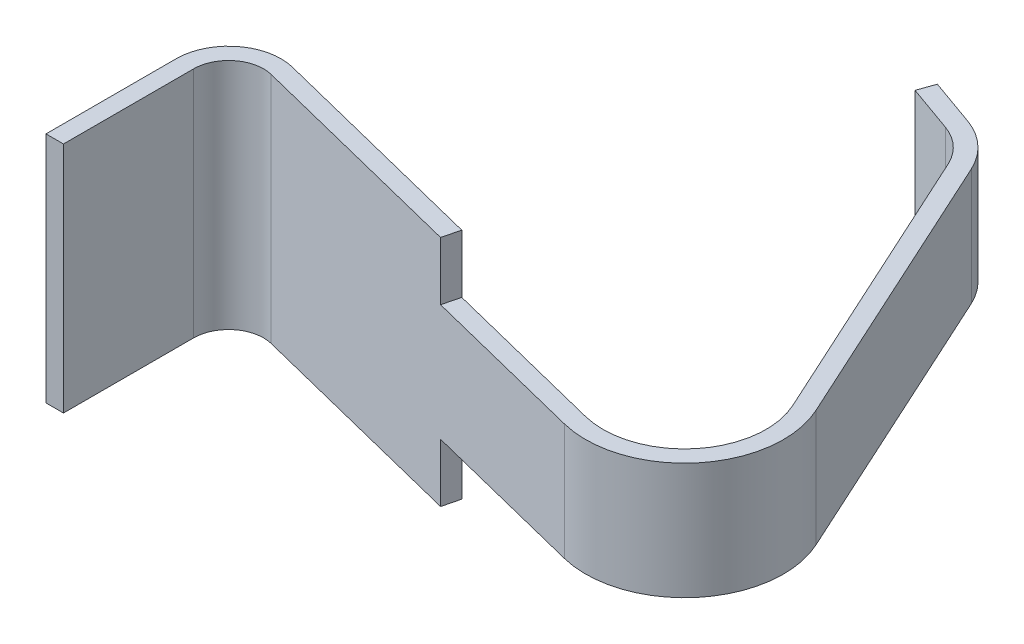
ISO-10303-21;
HEADER;
FILE_DESCRIPTION(('STEP AP214'),'2;1');
FILE_NAME('part.step','',(''),(''),'','','');
FILE_SCHEMA(('AUTOMOTIVE_DESIGN { 1 0 10303 214 1 1 1 1 }'));
ENDSEC;
DATA;
#1=APPLICATION_CONTEXT('core data for automotive mechanical design processes');
#2=APPLICATION_PROTOCOL_DEFINITION('international standard','automotive_design',2000,#1);
#3=PRODUCT_CONTEXT('',#1,'mechanical');
#4=PRODUCT('Part','Part','',(#3));
#5=PRODUCT_RELATED_PRODUCT_CATEGORY('part','',(#4));
#6=PRODUCT_DEFINITION_FORMATION('','',#4);
#7=PRODUCT_DEFINITION_CONTEXT('part definition',#1,'design');
#8=PRODUCT_DEFINITION('design','',#6,#7);
#9=PRODUCT_DEFINITION_SHAPE('','',#8);
#10=(LENGTH_UNIT() NAMED_UNIT(*) SI_UNIT(.MILLI.,.METRE.));
#11=(NAMED_UNIT(*) PLANE_ANGLE_UNIT() SI_UNIT($,.RADIAN.));
#12=(NAMED_UNIT(*) SI_UNIT($,.STERADIAN.) SOLID_ANGLE_UNIT());
#13=UNCERTAINTY_MEASURE_WITH_UNIT(LENGTH_MEASURE(1.E-05),#10,'distance_accuracy_value','');
#14=(GEOMETRIC_REPRESENTATION_CONTEXT(3) GLOBAL_UNCERTAINTY_ASSIGNED_CONTEXT((#13)) GLOBAL_UNIT_ASSIGNED_CONTEXT((#10,
#11,#12)) REPRESENTATION_CONTEXT('',''));
#15=CARTESIAN_POINT('',(0.,0.,0.));
#16=DIRECTION('',(0.,0.,1.));
#17=DIRECTION('',(1.,0.,0.));
#18=AXIS2_PLACEMENT_3D('',#15,#16,#17);
#19=CARTESIAN_POINT('',(77.525,12.04,-18.95765388203));
#20=DIRECTION('',(-1.,0.,0.));
#21=DIRECTION('',(0.,0.,-1.));
#22=AXIS2_PLACEMENT_3D('',#19,#20,#21);
#23=PLANE('',#22);
#24=DIRECTION('',(0.,0.,-1.));
#25=VECTOR('',#24,1.);
#26=CARTESIAN_POINT('',(77.525,12.,-19.5386529492));
#27=LINE('',#26,#25);
#28=CARTESIAN_POINT('',(77.5249999999993,12.,-18.9799999999987));
#29=VERTEX_POINT('',#28);
#30=CARTESIAN_POINT('',(77.525,12.,-20.0973058983995));
#31=VERTEX_POINT('',#30);
#32=EDGE_CURVE('E237',#29,#31,#27,.T.);
#33=ORIENTED_EDGE('',*,*,#32,.T.);
#34=DIRECTION('',(0.,-1.,0.));
#35=VECTOR('',#34,1.);
#36=CARTESIAN_POINT('',(77.525,11.,-20.0973058984001));
#37=LINE('',#36,#35);
#38=CARTESIAN_POINT('',(77.5249999999995,10.,-20.0973058983995));
#39=VERTEX_POINT('',#38);
#40=EDGE_CURVE('E157',#31,#39,#37,.T.);
#41=ORIENTED_EDGE('',*,*,#40,.T.);
#42=DIRECTION('',(0.,0.,1.));
#43=VECTOR('',#42,1.);
#44=CARTESIAN_POINT('',(77.524999999999,10.,-19.5386529492));
#45=LINE('',#44,#43);
#46=CARTESIAN_POINT('',(77.524999999999,10.,-18.9799999999993));
#47=VERTEX_POINT('',#46);
#48=EDGE_CURVE('E235',#39,#47,#45,.T.);
#49=ORIENTED_EDGE('',*,*,#48,.T.);
#50=DIRECTION('',(0.,-1.,0.));
#51=VECTOR('',#50,1.);
#52=CARTESIAN_POINT('',(77.524999999999,11.,-18.98));
#53=LINE('',#52,#51);
#54=EDGE_CURVE('E232',#29,#47,#53,.T.);
#55=ORIENTED_EDGE('',*,*,#54,.F.);
#56=EDGE_LOOP('',(#33,#41,#49,#55));
#57=FACE_BOUND('',#56,.T.);
#58=ADVANCED_FACE('F16',(#57),#23,.T.);
#59=CARTESIAN_POINT('',(77.68411331138,9.96,-18.98));
#60=DIRECTION('',(0.,0.,1.));
#61=DIRECTION('',(0.,1.,0.));
#62=AXIS2_PLACEMENT_3D('',#59,#60,#61);
#63=PLANE('',#62);
#64=DIRECTION('',(0.,1.,0.));
#65=VECTOR('',#64,1.);
#66=CARTESIAN_POINT('',(77.675,11.,-18.9799999999981));
#67=LINE('',#66,#65);
#68=CARTESIAN_POINT('',(77.675,10.,-18.9799999999987));
#69=VERTEX_POINT('',#68);
#70=CARTESIAN_POINT('',(77.675,12.,-18.979999999998));
#71=VERTEX_POINT('',#70);
#72=EDGE_CURVE('E201',#69,#71,#67,.T.);
#73=ORIENTED_EDGE('',*,*,#72,.T.);
#74=DIRECTION('',(1.,0.,0.));
#75=VECTOR('',#74,1.);
#76=CARTESIAN_POINT('',(77.6,12.,-18.979999999998));
#77=LINE('',#76,#75);
#78=EDGE_CURVE('E222',#29,#71,#77,.T.);
#79=ORIENTED_EDGE('',*,*,#78,.F.);
#80=ORIENTED_EDGE('',*,*,#54,.T.);
#81=DIRECTION('',(1.,0.,0.));
#82=VECTOR('',#81,1.);
#83=CARTESIAN_POINT('',(77.6,10.,-18.98));
#84=LINE('',#83,#82);
#85=EDGE_CURVE('E161',#47,#69,#84,.T.);
#86=ORIENTED_EDGE('',*,*,#85,.T.);
#87=EDGE_LOOP('',(#73,#79,#80,#86));
#88=FACE_BOUND('',#87,.T.);
#89=ADVANCED_FACE('F463',(#88),#63,.T.);
#90=CARTESIAN_POINT('',(77.975,12.,-20.0973058984));
#91=DIRECTION('',(0.,-1.,0.));
#92=DIRECTION('',(0.,0.,-1.));
#93=AXIS2_PLACEMENT_3D('',#90,#91,#92);
#94=CYLINDRICAL_SURFACE('',#93,0.449999999999992);
#95=CARTESIAN_POINT('',(77.975,12.,-20.0973058984));
#96=DIRECTION('',(0.,-1.,0.));
#97=DIRECTION('',(0.,0.,-1.));
#98=AXIS2_PLACEMENT_3D('',#95,#96,#97);
#99=CIRCLE('',#98,0.449999999999992);
#100=CARTESIAN_POINT('',(78.0841410312677,12.,-20.5338700234628));
#101=VERTEX_POINT('',#100);
#102=EDGE_CURVE('E20',#101,#31,#99,.F.);
#103=ORIENTED_EDGE('',*,*,#102,.F.);
#104=DIRECTION('',(0.,1.,0.));
#105=VECTOR('',#104,1.);
#106=CARTESIAN_POINT('',(78.0841410312706,11.,-20.5338700234598));
#107=LINE('',#106,#105);
#108=CARTESIAN_POINT('',(78.0841410312677,10.0000000000001,-20.5338700234628));
#109=VERTEX_POINT('',#108);
#110=EDGE_CURVE('E155',#109,#101,#107,.T.);
#111=ORIENTED_EDGE('',*,*,#110,.F.);
#112=CARTESIAN_POINT('',(77.975,10.0000000000001,-20.0973058984));
#113=DIRECTION('',(0.,-1.,0.));
#114=DIRECTION('',(0.,0.,-1.));
#115=AXIS2_PLACEMENT_3D('',#112,#113,#114);
#116=CIRCLE('',#115,0.449999999999992);
#117=EDGE_CURVE('E206',#109,#39,#116,.F.);
#118=ORIENTED_EDGE('',*,*,#117,.T.);
#119=ORIENTED_EDGE('',*,*,#40,.F.);
#120=EDGE_LOOP('',(#103,#111,#118,#119));
#121=FACE_BOUND('',#120,.T.);
#122=ADVANCED_FACE('F153',(#121),#94,.T.);
#123=CARTESIAN_POINT('',(77.675,12.04,-18.95765388203));
#124=DIRECTION('',(-1.,0.,0.));
#125=DIRECTION('',(0.,0.,-1.));
#126=AXIS2_PLACEMENT_3D('',#123,#124,#125);
#127=PLANE('',#126);
#128=DIRECTION('',(0.,0.,-1.));
#129=VECTOR('',#128,1.);
#130=CARTESIAN_POINT('',(77.675,12.,-19.5386529492));
#131=LINE('',#130,#129);
#132=CARTESIAN_POINT('',(77.675,12.,-20.0973058983994));
#133=VERTEX_POINT('',#132);
#134=EDGE_CURVE('E198',#71,#133,#131,.T.);
#135=ORIENTED_EDGE('',*,*,#134,.F.);
#136=ORIENTED_EDGE('',*,*,#72,.F.);
#137=DIRECTION('',(0.,0.,1.));
#138=VECTOR('',#137,1.);
#139=CARTESIAN_POINT('',(77.675,10.,-19.5386529492));
#140=LINE('',#139,#138);
#141=CARTESIAN_POINT('',(77.675,10.,-20.0973058983994));
#142=VERTEX_POINT('',#141);
#143=EDGE_CURVE('E204',#142,#69,#140,.T.);
#144=ORIENTED_EDGE('',*,*,#143,.F.);
#145=DIRECTION('',(0.,-1.,0.));
#146=VECTOR('',#145,1.);
#147=CARTESIAN_POINT('',(77.675,11.,-20.0973058984001));
#148=LINE('',#147,#146);
#149=EDGE_CURVE('E183',#133,#142,#148,.T.);
#150=ORIENTED_EDGE('',*,*,#149,.F.);
#151=EDGE_LOOP('',(#135,#136,#144,#150));
#152=FACE_BOUND('',#151,.T.);
#153=ADVANCED_FACE('F306',(#152),#127,.F.);
#154=CARTESIAN_POINT('',(78.01697703499,12.04,-20.55066102253));
#155=DIRECTION('',(0.242535625036986,0.,-0.970142500145169));
#156=DIRECTION('',(0.970142500145169,0.,0.242535625036986));
#157=AXIS2_PLACEMENT_3D('',#154,#155,#156);
#158=PLANE('',#157);
#159=DIRECTION('',(0.970142500145168,0.,0.242535625036987));
#160=VECTOR('',#159,1.);
#161=CARTESIAN_POINT('',(79.763240938285,11.5,-20.114095046705));
#162=LINE('',#161,#160);
#163=CARTESIAN_POINT('',(80.0244260315571,11.5,-20.0487987733888));
#164=VERTEX_POINT('',#163);
#165=CARTESIAN_POINT('',(81.4423408453007,11.5,-19.6943200699499));
#166=VERTEX_POINT('',#165);
#167=EDGE_CURVE('E192',#164,#166,#162,.T.);
#168=ORIENTED_EDGE('',*,*,#167,.T.);
#169=DIRECTION('',(0.,-1.,0.));
#170=VECTOR('',#169,1.);
#171=CARTESIAN_POINT('',(81.4423408452994,11.,-19.6943200699502));
#172=LINE('',#171,#170);
#173=CARTESIAN_POINT('',(81.4423408453007,10.5,-19.6943200699499));
#174=VERTEX_POINT('',#173);
#175=EDGE_CURVE('E213',#166,#174,#172,.T.);
#176=ORIENTED_EDGE('',*,*,#175,.T.);
#177=DIRECTION('',(-0.970142500145169,0.,-0.242535625036986));
#178=VECTOR('',#177,1.);
#179=CARTESIAN_POINT('',(79.763240938285,10.5,-20.114095046705));
#180=LINE('',#179,#178);
#181=CARTESIAN_POINT('',(80.024426031557,10.5,-20.048798773388));
#182=VERTEX_POINT('',#181);
#183=EDGE_CURVE('E200',#174,#182,#180,.T.);
#184=ORIENTED_EDGE('',*,*,#183,.T.);
#185=DIRECTION('',(0.,-1.,0.));
#186=VECTOR('',#185,1.);
#187=CARTESIAN_POINT('',(80.0244260315566,11.,-20.0487987733869));
#188=LINE('',#187,#186);
#189=CARTESIAN_POINT('',(80.0244260315579,10.,-20.0487987733919));
#190=VERTEX_POINT('',#189);
#191=EDGE_CURVE('E173',#182,#190,#188,.T.);
#192=ORIENTED_EDGE('',*,*,#191,.T.);
#193=DIRECTION('',(-0.970142500145853,0.,-0.242535625034248));
#194=VECTOR('',#193,1.);
#195=CARTESIAN_POINT('',(79.0542835314088,10.,-20.2913343984292));
#196=LINE('',#195,#194);
#197=EDGE_CURVE('E170',#190,#109,#196,.T.);
#198=ORIENTED_EDGE('',*,*,#197,.T.);
#199=ORIENTED_EDGE('',*,*,#110,.T.);
#200=DIRECTION('',(-0.970142500145853,0.,-0.242535625034248));
#201=VECTOR('',#200,1.);
#202=CARTESIAN_POINT('',(79.0542835314088,12.,-20.2913343984292));
#203=LINE('',#202,#201);
#204=CARTESIAN_POINT('',(80.0244260315544,12.,-20.0487987733925));
#205=VERTEX_POINT('',#204);
#206=EDGE_CURVE('E167',#205,#101,#203,.T.);
#207=ORIENTED_EDGE('',*,*,#206,.F.);
#208=DIRECTION('',(0.,-1.,0.));
#209=VECTOR('',#208,1.);
#210=CARTESIAN_POINT('',(80.0244260315566,11.,-20.0487987733869));
#211=LINE('',#210,#209);
#212=EDGE_CURVE('E172',#205,#164,#211,.T.);
#213=ORIENTED_EDGE('',*,*,#212,.T.);
#214=EDGE_LOOP('',(#168,#176,#184,#192,#198,#199,#207,#213));
#215=FACE_BOUND('',#214,.T.);
#216=ADVANCED_FACE('F165',(#215),#158,.T.);
#217=CARTESIAN_POINT('',(78.00674468483,10.,-20.38920886276));
#218=DIRECTION('',(0.,1.,0.));
#219=DIRECTION('',(0.970142500145049,0.,0.242535625037463));
#220=AXIS2_PLACEMENT_3D('',#217,#218,#219);
#221=PLANE('',#220);
#222=DIRECTION('',(-0.970142500145332,0.,-0.242535625036334));
#223=VECTOR('',#222,1.);
#224=CARTESIAN_POINT('',(79.72686059453,10.,-19.968573671685));
#225=LINE('',#224,#223);
#226=CARTESIAN_POINT('',(79.9880456878021,10.,-19.9032773983667));
#227=VERTEX_POINT('',#226);
#228=CARTESIAN_POINT('',(78.0477606875092,10.,-20.3883486484421));
#229=VERTEX_POINT('',#228);
#230=EDGE_CURVE('E340',#227,#229,#225,.T.);
#231=ORIENTED_EDGE('',*,*,#230,.T.);
#232=CARTESIAN_POINT('',(77.975,10.0000000000001,-20.0973058984));
#233=DIRECTION('',(0.,-1.,0.));
#234=DIRECTION('',(0.,0.,-1.));
#235=AXIS2_PLACEMENT_3D('',#232,#233,#234);
#236=CIRCLE('',#235,0.299999999999995);
#237=EDGE_CURVE('E292',#142,#229,#236,.T.);
#238=ORIENTED_EDGE('',*,*,#237,.F.);
#239=ORIENTED_EDGE('',*,*,#143,.T.);
#240=ORIENTED_EDGE('',*,*,#85,.F.);
#241=ORIENTED_EDGE('',*,*,#48,.F.);
#242=ORIENTED_EDGE('',*,*,#117,.F.);
#243=ORIENTED_EDGE('',*,*,#197,.F.);
#244=DIRECTION('',(0.242535625036338,0.,-0.970142500145331));
#245=VECTOR('',#244,1.);
#246=CARTESIAN_POINT('',(80.00623585968,10.,-19.97603808588));
#247=LINE('',#246,#245);
#248=EDGE_CURVE('E178',#227,#190,#247,.T.);
#249=ORIENTED_EDGE('',*,*,#248,.F.);
#250=EDGE_LOOP('',(#231,#238,#239,#240,#241,#242,#243,#249));
#251=FACE_BOUND('',#250,.T.);
#252=ADVANCED_FACE('F297',(#251),#221,.F.);
#253=CARTESIAN_POINT('',(77.975,12.,-20.0973058984));
#254=DIRECTION('',(0.,-1.,0.));
#255=DIRECTION('',(0.,0.,-1.));
#256=AXIS2_PLACEMENT_3D('',#253,#254,#255);
#257=CYLINDRICAL_SURFACE('',#256,0.299999999999995);
#258=CARTESIAN_POINT('',(77.975,12.,-20.0973058984));
#259=DIRECTION('',(0.,-1.,0.));
#260=DIRECTION('',(0.,0.,-1.));
#261=AXIS2_PLACEMENT_3D('',#258,#259,#260);
#262=CIRCLE('',#261,0.299999999999995);
#263=CARTESIAN_POINT('',(78.0477606875092,12.,-20.3883486484421));
#264=VERTEX_POINT('',#263);
#265=EDGE_CURVE('E197',#264,#133,#262,.F.);
#266=ORIENTED_EDGE('',*,*,#265,.T.);
#267=ORIENTED_EDGE('',*,*,#149,.T.);
#268=ORIENTED_EDGE('',*,*,#237,.T.);
#269=DIRECTION('',(0.,1.,0.));
#270=VECTOR('',#269,1.);
#271=CARTESIAN_POINT('',(78.0477606875108,11.,-20.3883486484398));
#272=LINE('',#271,#270);
#273=EDGE_CURVE('E312',#229,#264,#272,.T.);
#274=ORIENTED_EDGE('',*,*,#273,.T.);
#275=EDGE_LOOP('',(#266,#267,#268,#274));
#276=FACE_BOUND('',#275,.T.);
#277=ADVANCED_FACE('F310',(#276),#257,.F.);
#278=CARTESIAN_POINT('',(78.00674468483,12.,-20.38920886276));
#279=DIRECTION('',(0.,1.,0.));
#280=DIRECTION('',(0.970142500145049,0.,0.242535625037463));
#281=AXIS2_PLACEMENT_3D('',#278,#279,#280);
#282=PLANE('',#281);
#283=ORIENTED_EDGE('',*,*,#206,.T.);
#284=ORIENTED_EDGE('',*,*,#102,.T.);
#285=ORIENTED_EDGE('',*,*,#32,.F.);
#286=ORIENTED_EDGE('',*,*,#78,.T.);
#287=ORIENTED_EDGE('',*,*,#134,.T.);
#288=ORIENTED_EDGE('',*,*,#265,.F.);
#289=DIRECTION('',(0.970142500145332,0.,0.242535625036333));
#290=VECTOR('',#289,1.);
#291=CARTESIAN_POINT('',(79.72686059453,12.,-19.968573671685));
#292=LINE('',#291,#290);
#293=CARTESIAN_POINT('',(79.9880456878032,12.,-19.9032773983671));
#294=VERTEX_POINT('',#293);
#295=EDGE_CURVE('E314',#264,#294,#292,.T.);
#296=ORIENTED_EDGE('',*,*,#295,.T.);
#297=DIRECTION('',(0.242535624981862,0.,-0.97014250015895));
#298=VECTOR('',#297,1.);
#299=CARTESIAN_POINT('',(80.0062358596791,12.,-19.9760380858814));
#300=LINE('',#299,#298);
#301=EDGE_CURVE('E177',#294,#205,#300,.T.);
#302=ORIENTED_EDGE('',*,*,#301,.T.);
#303=EDGE_LOOP('',(#283,#284,#285,#286,#287,#288,#296,#302));
#304=FACE_BOUND('',#303,.T.);
#305=ADVANCED_FACE('F175',(#304),#282,.T.);
#306=CARTESIAN_POINT('',(80.02663633423,10.51,-20.05763998408));
#307=DIRECTION('',(0.970142500145331,0.,0.242535625036338));
#308=DIRECTION('',(-0.242535625036338,0.,0.970142500145331));
#309=AXIS2_PLACEMENT_3D('',#306,#307,#308);
#310=PLANE('',#309);
#311=DIRECTION('',(0.,-1.,0.));
#312=VECTOR('',#311,1.);
#313=CARTESIAN_POINT('',(79.9880456878023,11.,-19.9032773983669));
#314=LINE('',#313,#312);
#315=CARTESIAN_POINT('',(79.9880456878023,10.5,-19.9032773983678));
#316=VERTEX_POINT('',#315);
#317=EDGE_CURVE('E181',#316,#227,#314,.T.);
#318=ORIENTED_EDGE('',*,*,#317,.T.);
#319=ORIENTED_EDGE('',*,*,#248,.T.);
#320=ORIENTED_EDGE('',*,*,#191,.F.);
#321=DIRECTION('',(-0.242535625036013,0.,0.970142500145412));
#322=VECTOR('',#321,1.);
#323=CARTESIAN_POINT('',(80.4461879642918,10.5,-21.7358465043289));
#324=LINE('',#323,#322);
#325=EDGE_CURVE('E355',#182,#316,#324,.T.);
#326=ORIENTED_EDGE('',*,*,#325,.T.);
#327=EDGE_LOOP('',(#318,#319,#320,#326));
#328=FACE_BOUND('',#327,.T.);
#329=ADVANCED_FACE('F452',(#328),#310,.T.);
#330=CARTESIAN_POINT('',(77.98059669123,12.04,-20.40513964751));
#331=DIRECTION('',(0.242535625036334,0.,-0.970142500145332));
#332=DIRECTION('',(0.970142500145332,0.,0.242535625036334));
#333=AXIS2_PLACEMENT_3D('',#330,#331,#332);
#334=PLANE('',#333);
#335=DIRECTION('',(0.970142500145332,0.,0.242535625036334));
#336=VECTOR('',#335,1.);
#337=CARTESIAN_POINT('',(79.72686059453,11.5,-19.968573671685));
#338=LINE('',#337,#336);
#339=CARTESIAN_POINT('',(79.9880456878022,11.5,-19.9032773983669));
#340=VERTEX_POINT('',#339);
#341=CARTESIAN_POINT('',(81.4059605015484,11.5,-19.5487986949304));
#342=VERTEX_POINT('',#341);
#343=EDGE_CURVE('E322',#340,#342,#338,.T.);
#344=ORIENTED_EDGE('',*,*,#343,.F.);
#345=DIRECTION('',(0.,-1.,0.));
#346=VECTOR('',#345,1.);
#347=CARTESIAN_POINT('',(79.9880456878023,11.,-19.9032773983669));
#348=LINE('',#347,#346);
#349=EDGE_CURVE('E317',#294,#340,#348,.T.);
#350=ORIENTED_EDGE('',*,*,#349,.F.);
#351=ORIENTED_EDGE('',*,*,#295,.F.);
#352=ORIENTED_EDGE('',*,*,#273,.F.);
#353=ORIENTED_EDGE('',*,*,#230,.F.);
#354=ORIENTED_EDGE('',*,*,#317,.F.);
#355=DIRECTION('',(0.970142500145517,0.,0.242535625035592));
#356=VECTOR('',#355,1.);
#357=CARTESIAN_POINT('',(80.8905036346645,10.5,-19.6776629116534));
#358=LINE('',#357,#356);
#359=CARTESIAN_POINT('',(81.405960501549,10.5,-19.5487986949314));
#360=VERTEX_POINT('',#359);
#361=EDGE_CURVE('E289',#316,#360,#358,.T.);
#362=ORIENTED_EDGE('',*,*,#361,.T.);
#363=DIRECTION('',(0.,-1.,0.));
#364=VECTOR('',#363,1.);
#365=CARTESIAN_POINT('',(81.4059605015492,11.,-19.5487986949302));
#366=LINE('',#365,#364);
#367=EDGE_CURVE('E327',#342,#360,#366,.T.);
#368=ORIENTED_EDGE('',*,*,#367,.F.);
#369=EDGE_LOOP('',(#344,#350,#351,#352,#353,#354,#362,#368));
#370=FACE_BOUND('',#369,.T.);
#371=ADVANCED_FACE('F320',(#370),#334,.F.);
#372=CARTESIAN_POINT('',(79.47846541626,10.5,-19.95278827925));
#373=DIRECTION('',(0.,1.,0.));
#374=DIRECTION('',(0.970142500145537,0.,0.242535625035514));
#375=AXIS2_PLACEMENT_3D('',#372,#373,#374);
#376=PLANE('',#375);
#377=DIRECTION('',(0.416541056165614,0.,0.909116905864386));
#378=VECTOR('',#377,1.);
#379=CARTESIAN_POINT('',(81.684497939505,10.5,-21.89594958824));
#380=LINE('',#379,#378);
#381=CARTESIAN_POINT('',(81.1204982620727,10.5,-23.1269006171134));
#382=VERTEX_POINT('',#381);
#383=CARTESIAN_POINT('',(82.2484976169337,10.5,-20.6649985593758));
#384=VERTEX_POINT('',#383);
#385=EDGE_CURVE('E372',#382,#384,#380,.T.);
#386=ORIENTED_EDGE('',*,*,#385,.F.);
#387=CARTESIAN_POINT('',(80.66593980914,10.5,-22.91863008903));
#388=DIRECTION('',(0.,-1.,0.));
#389=DIRECTION('',(0.,0.,-1.));
#390=AXIS2_PLACEMENT_3D('',#387,#388,#389);
#391=CIRCLE('',#390,0.49999999999998);
#392=CARTESIAN_POINT('',(80.8334105206579,10.5,-23.3897495651508));
#393=VERTEX_POINT('',#392);
#394=EDGE_CURVE('E281',#393,#382,#391,.T.);
#395=ORIENTED_EDGE('',*,*,#394,.F.);
#396=DIRECTION('',(-0.942238952245806,0.,-0.334941423043979));
#397=VECTOR('',#396,1.);
#398=CARTESIAN_POINT('',(80.84199743762,10.5,-23.38669713967));
#399=LINE('',#398,#397);
#400=CARTESIAN_POINT('',(80.4304691303441,10.5,-23.5329847416985));
#401=VERTEX_POINT('',#400);
#402=EDGE_CURVE('E283',#401,#393,#399,.F.);
#403=ORIENTED_EDGE('',*,*,#402,.F.);
#404=DIRECTION('',(-0.334941423036533,0.,0.942238952248453));
#405=VECTOR('',#404,1.);
#406=CARTESIAN_POINT('',(80.48376276928,10.5,-23.6829075015));
#407=LINE('',#406,#405);
#408=CARTESIAN_POINT('',(80.480710343797,10.5,-23.6743205845315));
#409=VERTEX_POINT('',#408);
#410=EDGE_CURVE('E285',#409,#401,#407,.T.);
#411=ORIENTED_EDGE('',*,*,#410,.F.);
#412=DIRECTION('',(-0.942238952255403,0.,-0.334941423016981));
#413=VECTOR('',#412,1.);
#414=CARTESIAN_POINT('',(80.89223865108,10.5,-23.52803298251));
#415=LINE('',#414,#413);
#416=CARTESIAN_POINT('',(80.883651734108,10.5,-23.5310854079941));
#417=VERTEX_POINT('',#416);
#418=EDGE_CURVE('E287',#417,#409,#415,.T.);
#419=ORIENTED_EDGE('',*,*,#418,.F.);
#420=CARTESIAN_POINT('',(80.66593980914,10.5,-22.91863008903));
#421=DIRECTION('',(0.,-1.,0.));
#422=DIRECTION('',(0.,0.,-1.));
#423=AXIS2_PLACEMENT_3D('',#420,#421,#422);
#424=CIRCLE('',#423,0.649999999999977);
#425=CARTESIAN_POINT('',(81.2568657979536,10.5,-23.1893817755384));
#426=VERTEX_POINT('',#425);
#427=EDGE_CURVE('E270',#417,#426,#424,.T.);
#428=ORIENTED_EDGE('',*,*,#427,.T.);
#429=DIRECTION('',(0.416541056164278,0.,0.909116905864998));
#430=VECTOR('',#429,1.);
#431=CARTESIAN_POINT('',(81.820865475385,10.5,-21.958430746665));
#432=LINE('',#431,#430);
#433=CARTESIAN_POINT('',(82.3848651528122,10.5,-20.7274797177964));
#434=VERTEX_POINT('',#433);
#435=EDGE_CURVE('E277',#426,#434,#432,.T.);
#436=ORIENTED_EDGE('',*,*,#435,.T.);
#437=CARTESIAN_POINT('',(81.61211578283,10.5,-20.37341982006));
#438=DIRECTION('',(0.,-1.,0.));
#439=DIRECTION('',(0.,0.,-1.));
#440=AXIS2_PLACEMENT_3D('',#437,#438,#439);
#441=CIRCLE('',#440,0.849999999999969);
#442=EDGE_CURVE('E274',#434,#360,#441,.T.);
#443=ORIENTED_EDGE('',*,*,#442,.T.);
#444=ORIENTED_EDGE('',*,*,#361,.F.);
#445=ORIENTED_EDGE('',*,*,#325,.F.);
#446=ORIENTED_EDGE('',*,*,#183,.F.);
#447=CARTESIAN_POINT('',(81.61211578283,10.5,-20.37341982006));
#448=DIRECTION('',(0.,-1.,0.));
#449=DIRECTION('',(0.,0.,-1.));
#450=AXIS2_PLACEMENT_3D('',#447,#448,#449);
#451=CIRCLE('',#450,0.699999999999958);
#452=EDGE_CURVE('E278',#384,#174,#451,.T.);
#453=ORIENTED_EDGE('',*,*,#452,.F.);
#454=EDGE_LOOP('',(#386,#395,#403,#411,#419,#428,#436,#443,#444,#445,#446,#453));
#455=FACE_BOUND('',#454,.T.);
#456=ADVANCED_FACE('F383',(#455),#376,.F.);
#457=CARTESIAN_POINT('',(80.02663633423,11.49,-20.05763998408));
#458=DIRECTION('',(-0.970142500145331,0.,-0.242535625036338));
#459=DIRECTION('',(-0.242535625036338,0.,0.970142500145331));
#460=AXIS2_PLACEMENT_3D('',#457,#458,#459);
#461=PLANE('',#460);
#462=ORIENTED_EDGE('',*,*,#349,.T.);
#463=DIRECTION('',(-0.242535625036013,0.,0.970142500145412));
#464=VECTOR('',#463,1.);
#465=CARTESIAN_POINT('',(80.4461879642918,11.5,-21.7358465043289));
#466=LINE('',#465,#464);
#467=EDGE_CURVE('E269',#164,#340,#466,.T.);
#468=ORIENTED_EDGE('',*,*,#467,.F.);
#469=ORIENTED_EDGE('',*,*,#212,.F.);
#470=ORIENTED_EDGE('',*,*,#301,.F.);
#471=EDGE_LOOP('',(#462,#468,#469,#470));
#472=FACE_BOUND('',#471,.T.);
#473=ADVANCED_FACE('F445',(#472),#461,.F.);
#474=CARTESIAN_POINT('',(81.61211578283,11.5,-20.37341982006));
#475=DIRECTION('',(0.,-1.,0.));
#476=DIRECTION('',(0.,0.,-1.));
#477=AXIS2_PLACEMENT_3D('',#474,#475,#476);
#478=CYLINDRICAL_SURFACE('',#477,0.849999999999969);
#479=CARTESIAN_POINT('',(81.61211578283,11.5,-20.37341982006));
#480=DIRECTION('',(0.,-1.,0.));
#481=DIRECTION('',(0.,0.,-1.));
#482=AXIS2_PLACEMENT_3D('',#479,#480,#481);
#483=CIRCLE('',#482,0.849999999999969);
#484=CARTESIAN_POINT('',(82.3848651528126,11.5,-20.7274797177976));
#485=VERTEX_POINT('',#484);
#486=EDGE_CURVE('E266',#342,#485,#483,.F.);
#487=ORIENTED_EDGE('',*,*,#486,.F.);
#488=ORIENTED_EDGE('',*,*,#367,.T.);
#489=ORIENTED_EDGE('',*,*,#442,.F.);
#490=DIRECTION('',(0.,1.,0.));
#491=VECTOR('',#490,1.);
#492=CARTESIAN_POINT('',(82.3848651528129,11.,-20.7274797177948));
#493=LINE('',#492,#491);
#494=EDGE_CURVE('E273',#434,#485,#493,.T.);
#495=ORIENTED_EDGE('',*,*,#494,.T.);
#496=EDGE_LOOP('',(#487,#488,#489,#495));
#497=FACE_BOUND('',#496,.T.);
#498=ADVANCED_FACE('F391',(#497),#478,.T.);
#499=CARTESIAN_POINT('',(82.40742513991,11.52,-20.67824167664));
#500=DIRECTION('',(-0.909116905864998,0.,0.416541056164278));
#501=DIRECTION('',(-0.416541056164278,0.,-0.909116905864998));
#502=AXIS2_PLACEMENT_3D('',#499,#500,#501);
#503=PLANE('',#502);
#504=DIRECTION('',(-0.416541056166264,0.,-0.909116905864088));
#505=VECTOR('',#504,1.);
#506=CARTESIAN_POINT('',(82.3848651528137,11.5,-20.7274797177971));
#507=LINE('',#506,#505);
#508=CARTESIAN_POINT('',(81.2568657979514,11.5,-23.1893817755381));
#509=VERTEX_POINT('',#508);
#510=EDGE_CURVE('E263',#485,#509,#507,.T.);
#511=ORIENTED_EDGE('',*,*,#510,.F.);
#512=ORIENTED_EDGE('',*,*,#494,.F.);
#513=ORIENTED_EDGE('',*,*,#435,.F.);
#514=DIRECTION('',(0.,1.,0.));
#515=VECTOR('',#514,1.);
#516=CARTESIAN_POINT('',(81.2568657979515,11.,-23.1893817755384));
#517=LINE('',#516,#515);
#518=EDGE_CURVE('E272',#426,#509,#517,.T.);
#519=ORIENTED_EDGE('',*,*,#518,.T.);
#520=EDGE_LOOP('',(#511,#512,#513,#519));
#521=FACE_BOUND('',#520,.T.);
#522=ADVANCED_FACE('F393',(#521),#503,.F.);
#523=CARTESIAN_POINT('',(80.66593980914,11.5,-22.91863008903));
#524=DIRECTION('',(0.,-1.,0.));
#525=DIRECTION('',(0.,0.,-1.));
#526=AXIS2_PLACEMENT_3D('',#523,#524,#525);
#527=CYLINDRICAL_SURFACE('',#526,0.649999999999977);
#528=CARTESIAN_POINT('',(80.66593980914,11.5,-22.91863008903));
#529=DIRECTION('',(0.,-1.,0.));
#530=DIRECTION('',(0.,0.,-1.));
#531=AXIS2_PLACEMENT_3D('',#528,#529,#530);
#532=CIRCLE('',#531,0.649999999999977);
#533=CARTESIAN_POINT('',(80.8836517341149,11.5,-23.5310854079913));
#534=VERTEX_POINT('',#533);
#535=EDGE_CURVE('E260',#509,#534,#532,.F.);
#536=ORIENTED_EDGE('',*,*,#535,.F.);
#537=ORIENTED_EDGE('',*,*,#518,.F.);
#538=ORIENTED_EDGE('',*,*,#427,.F.);
#539=DIRECTION('',(0.,1.,0.));
#540=VECTOR('',#539,1.);
#541=CARTESIAN_POINT('',(80.8836517341148,11.,-23.5310854079916));
#542=LINE('',#541,#540);
#543=EDGE_CURVE('E361',#417,#534,#542,.T.);
#544=ORIENTED_EDGE('',*,*,#543,.T.);
#545=EDGE_LOOP('',(#536,#537,#538,#544));
#546=FACE_BOUND('',#545,.T.);
#547=ADVANCED_FACE('F442',(#546),#527,.T.);
#548=CARTESIAN_POINT('',(82.27105760403,11.52,-20.61576051822));
#549=DIRECTION('',(-0.909116905864386,0.,0.416541056165615));
#550=DIRECTION('',(-0.416541056165615,0.,-0.909116905864386));
#551=AXIS2_PLACEMENT_3D('',#548,#549,#550);
#552=PLANE('',#551);
#553=DIRECTION('',(0.416541056166023,0.,0.909116905864198));
#554=VECTOR('',#553,1.);
#555=CARTESIAN_POINT('',(81.1204982620732,11.5,-23.1269006171118));
#556=LINE('',#555,#554);
#557=CARTESIAN_POINT('',(81.1204982620722,11.5,-23.1269006171133));
#558=VERTEX_POINT('',#557);
#559=CARTESIAN_POINT('',(82.2484976169338,11.5,-20.664998559376));
#560=VERTEX_POINT('',#559);
#561=EDGE_CURVE('E252',#558,#560,#556,.T.);
#562=ORIENTED_EDGE('',*,*,#561,.F.);
#563=DIRECTION('',(0.,1.,0.));
#564=VECTOR('',#563,1.);
#565=CARTESIAN_POINT('',(81.1204982620719,11.,-23.1269006171134));
#566=LINE('',#565,#564);
#567=EDGE_CURVE('E360',#382,#558,#566,.T.);
#568=ORIENTED_EDGE('',*,*,#567,.F.);
#569=ORIENTED_EDGE('',*,*,#385,.T.);
#570=DIRECTION('',(0.,-1.,0.));
#571=VECTOR('',#570,1.);
#572=CARTESIAN_POINT('',(82.2484976169347,11.,-20.6649985593767));
#573=LINE('',#572,#571);
#574=EDGE_CURVE('E366',#560,#384,#573,.T.);
#575=ORIENTED_EDGE('',*,*,#574,.F.);
#576=EDGE_LOOP('',(#562,#568,#569,#575));
#577=FACE_BOUND('',#576,.T.);
#578=ADVANCED_FACE('F402',(#577),#552,.T.);
#579=CARTESIAN_POINT('',(81.61211578283,11.5,-20.37341982006));
#580=DIRECTION('',(0.,-1.,0.));
#581=DIRECTION('',(0.,0.,-1.));
#582=AXIS2_PLACEMENT_3D('',#579,#580,#581);
#583=CYLINDRICAL_SURFACE('',#582,0.699999999999958);
#584=CARTESIAN_POINT('',(81.61211578283,11.5,-20.37341982006));
#585=DIRECTION('',(0.,-1.,0.));
#586=DIRECTION('',(0.,0.,-1.));
#587=AXIS2_PLACEMENT_3D('',#584,#585,#586);
#588=CIRCLE('',#587,0.699999999999958);
#589=EDGE_CURVE('E248',#560,#166,#588,.T.);
#590=ORIENTED_EDGE('',*,*,#589,.F.);
#591=ORIENTED_EDGE('',*,*,#574,.T.);
#592=ORIENTED_EDGE('',*,*,#452,.T.);
#593=ORIENTED_EDGE('',*,*,#175,.F.);
#594=EDGE_LOOP('',(#590,#591,#592,#593));
#595=FACE_BOUND('',#594,.T.);
#596=ADVANCED_FACE('F399',(#595),#583,.F.);
#597=CARTESIAN_POINT('',(80.89223865108,11.52,-23.52803298251));
#598=DIRECTION('',(-0.334941423016981,0.,0.942238952255403));
#599=DIRECTION('',(-0.942238952255403,0.,-0.334941423016981));
#600=AXIS2_PLACEMENT_3D('',#597,#598,#599);
#601=PLANE('',#600);
#602=DIRECTION('',(-0.942238952247696,0.,-0.334941423038662));
#603=VECTOR('',#602,1.);
#604=CARTESIAN_POINT('',(80.8836517341145,11.5,-23.5310854079912));
#605=LINE('',#604,#603);
#606=CARTESIAN_POINT('',(80.4807103437985,11.5,-23.6743205845359));
#607=VERTEX_POINT('',#606);
#608=EDGE_CURVE('E258',#534,#607,#605,.T.);
#609=ORIENTED_EDGE('',*,*,#608,.F.);
#610=ORIENTED_EDGE('',*,*,#543,.F.);
#611=ORIENTED_EDGE('',*,*,#418,.T.);
#612=DIRECTION('',(0.,1.,0.));
#613=VECTOR('',#612,1.);
#614=CARTESIAN_POINT('',(80.4807103437981,11.,-23.6743205845347));
#615=LINE('',#614,#613);
#616=EDGE_CURVE('E251',#409,#607,#615,.T.);
#617=ORIENTED_EDGE('',*,*,#616,.T.);
#618=EDGE_LOOP('',(#609,#610,#611,#617));
#619=FACE_BOUND('',#618,.T.);
#620=ADVANCED_FACE('F424',(#619),#601,.F.);
#621=CARTESIAN_POINT('',(80.66593980914,11.5,-22.91863008903));
#622=DIRECTION('',(0.,-1.,0.));
#623=DIRECTION('',(0.,0.,-1.));
#624=AXIS2_PLACEMENT_3D('',#621,#622,#623);
#625=CYLINDRICAL_SURFACE('',#624,0.49999999999998);
#626=CARTESIAN_POINT('',(80.66593980914,11.5,-22.91863008903));
#627=DIRECTION('',(0.,-1.,0.));
#628=DIRECTION('',(0.,0.,-1.));
#629=AXIS2_PLACEMENT_3D('',#626,#627,#628);
#630=CIRCLE('',#629,0.49999999999998);
#631=CARTESIAN_POINT('',(80.8334105206579,11.5,-23.3897495651508));
#632=VERTEX_POINT('',#631);
#633=EDGE_CURVE('E255',#632,#558,#630,.T.);
#634=ORIENTED_EDGE('',*,*,#633,.F.);
#635=DIRECTION('',(0.,1.,0.));
#636=VECTOR('',#635,1.);
#637=CARTESIAN_POINT('',(80.833410520655,11.,-23.3897495651518));
#638=LINE('',#637,#636);
#639=EDGE_CURVE('E409',#393,#632,#638,.T.);
#640=ORIENTED_EDGE('',*,*,#639,.F.);
#641=ORIENTED_EDGE('',*,*,#394,.T.);
#642=ORIENTED_EDGE('',*,*,#567,.T.);
#643=EDGE_LOOP('',(#634,#640,#641,#642));
#644=FACE_BOUND('',#643,.T.);
#645=ADVANCED_FACE('F407',(#644),#625,.F.);
#646=CARTESIAN_POINT('',(79.47846541626,11.5,-19.95278827925));
#647=DIRECTION('',(0.,1.,0.));
#648=DIRECTION('',(0.970142500145537,0.,0.242535625035514));
#649=AXIS2_PLACEMENT_3D('',#646,#647,#648);
#650=PLANE('',#649);
#651=ORIENTED_EDGE('',*,*,#561,.T.);
#652=ORIENTED_EDGE('',*,*,#589,.T.);
#653=ORIENTED_EDGE('',*,*,#167,.F.);
#654=ORIENTED_EDGE('',*,*,#467,.T.);
#655=ORIENTED_EDGE('',*,*,#343,.T.);
#656=ORIENTED_EDGE('',*,*,#486,.T.);
#657=ORIENTED_EDGE('',*,*,#510,.T.);
#658=ORIENTED_EDGE('',*,*,#535,.T.);
#659=ORIENTED_EDGE('',*,*,#608,.T.);
#660=DIRECTION('',(-0.334941423036533,0.,0.942238952248453));
#661=VECTOR('',#660,1.);
#662=CARTESIAN_POINT('',(80.45558973707,11.5,-23.603652663115));
#663=LINE('',#662,#661);
#664=CARTESIAN_POINT('',(80.4304691303441,11.5,-23.5329847416985));
#665=VERTEX_POINT('',#664);
#666=EDGE_CURVE('E35',#607,#665,#663,.T.);
#667=ORIENTED_EDGE('',*,*,#666,.T.);
#668=DIRECTION('',(-0.942238952245802,0.,-0.334941423043989));
#669=VECTOR('',#668,1.);
#670=CARTESIAN_POINT('',(80.6319398255,11.5,-23.461367153425));
#671=LINE('',#670,#669);
#672=EDGE_CURVE('E26',#632,#665,#671,.T.);
#673=ORIENTED_EDGE('',*,*,#672,.F.);
#674=ORIENTED_EDGE('',*,*,#633,.T.);
#675=EDGE_LOOP('',(#651,#652,#653,#654,#655,#656,#657,#658,#659,#667,#673,#674));
#676=FACE_BOUND('',#675,.T.);
#677=ADVANCED_FACE('F395',(#676),#650,.T.);
#678=CARTESIAN_POINT('',(80.48376276928,10.48,-23.6829075015));
#679=DIRECTION('',(0.942238952248453,0.,0.334941423036533));
#680=DIRECTION('',(0.,1.,0.));
#681=AXIS2_PLACEMENT_3D('',#678,#679,#680);
#682=PLANE('',#681);
#683=ORIENTED_EDGE('',*,*,#666,.F.);
#684=ORIENTED_EDGE('',*,*,#616,.F.);
#685=ORIENTED_EDGE('',*,*,#410,.T.);
#686=DIRECTION('',(0.,-1.,0.));
#687=VECTOR('',#686,1.);
#688=CARTESIAN_POINT('',(80.430469130345,11.,-23.5329847416982));
#689=LINE('',#688,#687);
#690=EDGE_CURVE('E11',#665,#401,#689,.T.);
#691=ORIENTED_EDGE('',*,*,#690,.F.);
#692=EDGE_LOOP('',(#683,#684,#685,#691));
#693=FACE_BOUND('',#692,.T.);
#694=ADVANCED_FACE('F427',(#693),#682,.F.);
#695=CARTESIAN_POINT('',(80.84199743762,11.52,-23.38669713967));
#696=DIRECTION('',(-0.334941423043979,0.,0.942238952245806));
#697=DIRECTION('',(-0.942238952245806,0.,-0.334941423043979));
#698=AXIS2_PLACEMENT_3D('',#695,#696,#697);
#699=PLANE('',#698);
#700=ORIENTED_EDGE('',*,*,#672,.T.);
#701=ORIENTED_EDGE('',*,*,#690,.T.);
#702=ORIENTED_EDGE('',*,*,#402,.T.);
#703=ORIENTED_EDGE('',*,*,#639,.T.);
#704=EDGE_LOOP('',(#700,#701,#702,#703));
#705=FACE_BOUND('',#704,.T.);
#706=ADVANCED_FACE('F18',(#705),#699,.T.);
#707=CLOSED_SHELL('',(#58,#89,#122,#153,#216,#252,#277,#305,#329,#371,#456,#473,#498,#522,#547,
#578,#596,#620,#645,#677,#694,#706));
#708=MANIFOLD_SOLID_BREP('B1',#707);
#709=ADVANCED_BREP_SHAPE_REPRESENTATION('',(#18,#708),#14);
#710=SHAPE_DEFINITION_REPRESENTATION(#9,#709);
ENDSEC;
END-ISO-10303-21;
